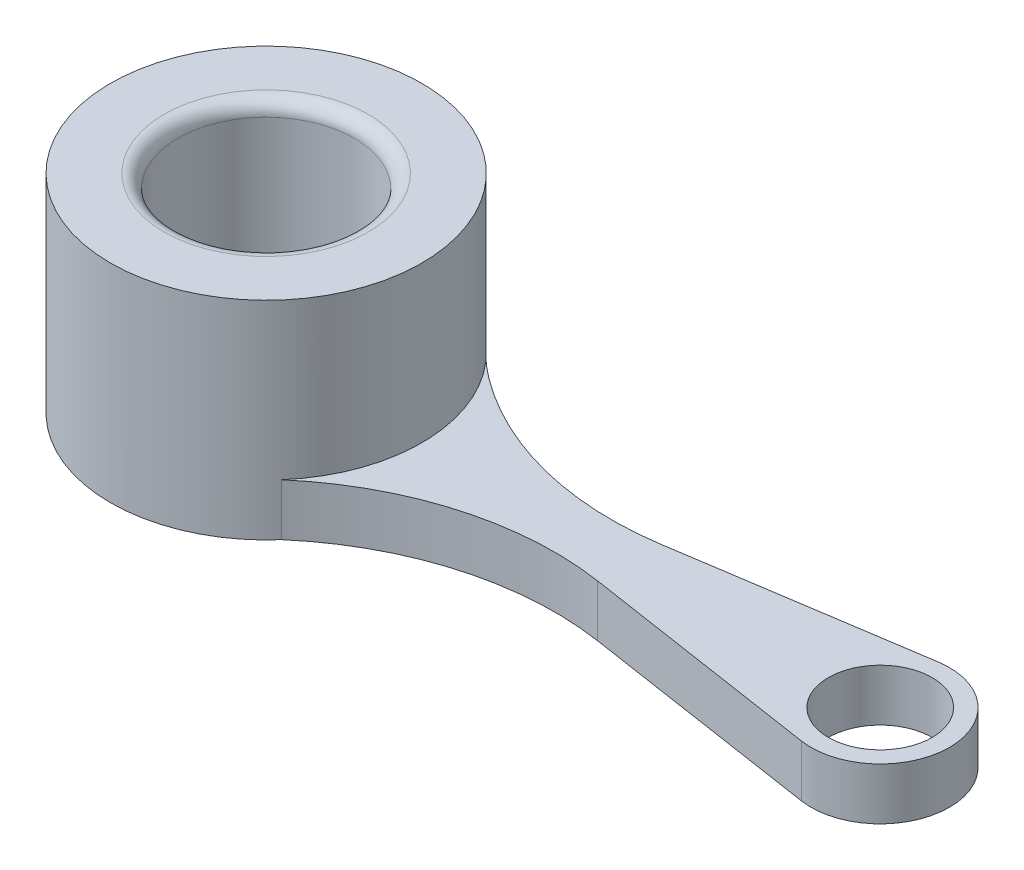
ISO-10303-21;
HEADER;
FILE_DESCRIPTION(('STEP AP214'),'2;1');
FILE_NAME('part.step','',(''),(''),'','','');
FILE_SCHEMA(('AUTOMOTIVE_DESIGN { 1 0 10303 214 1 1 1 1 }'));
ENDSEC;
DATA;
#1=APPLICATION_CONTEXT('core data for automotive mechanical design processes');
#2=APPLICATION_PROTOCOL_DEFINITION('international standard','automotive_design',2000,#1);
#3=PRODUCT_CONTEXT('',#1,'mechanical');
#4=PRODUCT('Part','Part','',(#3));
#5=PRODUCT_RELATED_PRODUCT_CATEGORY('part','',(#4));
#6=PRODUCT_DEFINITION_FORMATION('','',#4);
#7=PRODUCT_DEFINITION_CONTEXT('part definition',#1,'design');
#8=PRODUCT_DEFINITION('design','',#6,#7);
#9=PRODUCT_DEFINITION_SHAPE('','',#8);
#10=(LENGTH_UNIT() NAMED_UNIT(*) SI_UNIT(.MILLI.,.METRE.));
#11=(NAMED_UNIT(*) PLANE_ANGLE_UNIT() SI_UNIT($,.RADIAN.));
#12=(NAMED_UNIT(*) SI_UNIT($,.STERADIAN.) SOLID_ANGLE_UNIT());
#13=UNCERTAINTY_MEASURE_WITH_UNIT(LENGTH_MEASURE(1.E-05),#10,'distance_accuracy_value','');
#14=(GEOMETRIC_REPRESENTATION_CONTEXT(3) GLOBAL_UNCERTAINTY_ASSIGNED_CONTEXT((#13)) GLOBAL_UNIT_ASSIGNED_CONTEXT((#10,
#11,#12)) REPRESENTATION_CONTEXT('',''));
#15=CARTESIAN_POINT('',(0.,0.,0.));
#16=DIRECTION('',(0.,0.,1.));
#17=DIRECTION('',(1.,0.,0.));
#18=AXIS2_PLACEMENT_3D('',#15,#16,#17);
#19=CARTESIAN_POINT('',(0.,1.5,0.));
#20=DIRECTION('',(0.,1.,0.));
#21=DIRECTION('',(0.,0.,1.));
#22=AXIS2_PLACEMENT_3D('',#19,#20,#21);
#23=PLANE('',#22);
#24=CARTESIAN_POINT('',(22.25,1.5,-4.5));
#25=DIRECTION('',(0.,1.,0.));
#26=DIRECTION('',(0.,0.,1.));
#27=AXIS2_PLACEMENT_3D('',#24,#25,#26);
#28=CIRCLE('',#27,1.5);
#29=CARTESIAN_POINT('',(22.25,1.5,-3.));
#30=VERTEX_POINT('',#29);
#31=EDGE_CURVE('E168',#30,#30,#28,.F.);
#32=ORIENTED_EDGE('',*,*,#31,.T.);
#33=EDGE_LOOP('',(#32));
#34=FACE_BOUND('',#33,.T.);
#35=DIRECTION('',(0.988542407353188,0.,-0.150943396226415));
#36=VECTOR('',#35,1.);
#37=CARTESIAN_POINT('',(-0.466407587479488,1.5,-3.05454687559282));
#38=LINE('',#37,#36);
#39=CARTESIAN_POINT('',(15.,1.5,-5.41615733490219));
#40=VERTEX_POINT('',#39);
#41=CARTESIAN_POINT('',(21.9481132075472,1.5,-6.47708481470638));
#42=VERTEX_POINT('',#41);
#43=EDGE_CURVE('E112',#40,#42,#38,.T.);
#44=ORIENTED_EDGE('',*,*,#43,.F.);
#45=CARTESIAN_POINT('',(13.6637486076991,1.5,-14.167392574056));
#46=DIRECTION('',(0.,1.,0.));
#47=DIRECTION('',(0.,0.,1.));
#48=AXIS2_PLACEMENT_3D('',#45,#46,#47);
#49=CIRCLE('',#48,8.85266547399335);
#50=CARTESIAN_POINT('',(7.899255542353,1.5,-7.44873901147294));
#51=VERTEX_POINT('',#50);
#52=EDGE_CURVE('E56',#40,#51,#49,.F.);
#53=ORIENTED_EDGE('',*,*,#52,.T.);
#54=CARTESIAN_POINT('',(4.5,1.5,-4.5));
#55=DIRECTION('',(0.,1.,0.));
#56=DIRECTION('',(0.,0.,1.));
#57=AXIS2_PLACEMENT_3D('',#54,#55,#56);
#58=CIRCLE('',#57,4.5);
#59=CARTESIAN_POINT('',(7.89925554235302,1.5,-1.55126098852708));
#60=VERTEX_POINT('',#59);
#61=EDGE_CURVE('E164',#60,#51,#58,.T.);
#62=ORIENTED_EDGE('',*,*,#61,.F.);
#63=CARTESIAN_POINT('',(13.6637486076991,1.5,5.16739257405602));
#64=DIRECTION('',(0.,1.,0.));
#65=DIRECTION('',(0.,0.,1.));
#66=AXIS2_PLACEMENT_3D('',#63,#64,#65);
#67=CIRCLE('',#66,8.85266547399335);
#68=CARTESIAN_POINT('',(15.,1.5,-3.58384266509782));
#69=VERTEX_POINT('',#68);
#70=EDGE_CURVE('E123',#69,#60,#67,.T.);
#71=ORIENTED_EDGE('',*,*,#70,.F.);
#72=DIRECTION('',(0.988542407353188,0.,0.150943396226415));
#73=VECTOR('',#72,1.);
#74=CARTESIAN_POINT('',(0.87651794703805,1.5,-5.7403979446279));
#75=LINE('',#74,#73);
#76=CARTESIAN_POINT('',(21.9481132075472,1.5,-2.52291518529362));
#77=VERTEX_POINT('',#76);
#78=EDGE_CURVE('E119',#69,#77,#75,.T.);
#79=ORIENTED_EDGE('',*,*,#78,.T.);
#80=CARTESIAN_POINT('',(22.25,1.5,-4.5));
#81=DIRECTION('',(0.,1.,0.));
#82=DIRECTION('',(0.,0.,1.));
#83=AXIS2_PLACEMENT_3D('',#80,#81,#82);
#84=CIRCLE('',#83,2.);
#85=EDGE_CURVE('E101',#77,#42,#84,.T.);
#86=ORIENTED_EDGE('',*,*,#85,.T.);
#87=EDGE_LOOP('',(#44,#53,#62,#71,#79,#86));
#88=FACE_BOUND('',#87,.T.);
#89=ADVANCED_FACE('F39',(#34,#88),#23,.T.);
#90=CARTESIAN_POINT('',(0.,6.,0.));
#91=DIRECTION('',(0.,1.,0.));
#92=DIRECTION('',(0.,0.,1.));
#93=AXIS2_PLACEMENT_3D('',#90,#91,#92);
#94=PLANE('',#93);
#95=CARTESIAN_POINT('',(4.5,6.,-4.5));
#96=DIRECTION('',(0.,1.,0.));
#97=DIRECTION('',(0.,0.,1.));
#98=AXIS2_PLACEMENT_3D('',#95,#96,#97);
#99=CIRCLE('',#98,2.95);
#100=CARTESIAN_POINT('',(4.5,6.,-1.55));
#101=VERTEX_POINT('',#100);
#102=EDGE_CURVE('E11',#101,#101,#99,.F.);
#103=ORIENTED_EDGE('',*,*,#102,.T.);
#104=EDGE_LOOP('',(#103));
#105=FACE_BOUND('',#104,.T.);
#106=CARTESIAN_POINT('',(4.5,6.,-4.5));
#107=DIRECTION('',(0.,1.,0.));
#108=DIRECTION('',(0.,0.,1.));
#109=AXIS2_PLACEMENT_3D('',#106,#107,#108);
#110=CIRCLE('',#109,4.5);
#111=CARTESIAN_POINT('',(4.5,6.,0.));
#112=VERTEX_POINT('',#111);
#113=EDGE_CURVE('E163',#112,#112,#110,.T.);
#114=ORIENTED_EDGE('',*,*,#113,.T.);
#115=EDGE_LOOP('',(#114));
#116=FACE_BOUND('',#115,.T.);
#117=ADVANCED_FACE('F206',(#105,#116),#94,.T.);
#118=CARTESIAN_POINT('',(0.,0.,0.));
#119=DIRECTION('',(0.,1.,0.));
#120=DIRECTION('',(0.,0.,1.));
#121=AXIS2_PLACEMENT_3D('',#118,#119,#120);
#122=PLANE('',#121);
#123=CARTESIAN_POINT('',(4.5,0.,-4.5));
#124=DIRECTION('',(0.,1.,0.));
#125=DIRECTION('',(0.,0.,1.));
#126=AXIS2_PLACEMENT_3D('',#123,#124,#125);
#127=CIRCLE('',#126,4.5);
#128=CARTESIAN_POINT('',(7.899255542353,0.,-7.44873901147294));
#129=VERTEX_POINT('',#128);
#130=CARTESIAN_POINT('',(7.89925554235302,0.,-1.55126098852708));
#131=VERTEX_POINT('',#130);
#132=EDGE_CURVE('E64',#129,#131,#127,.T.);
#133=ORIENTED_EDGE('',*,*,#132,.F.);
#134=CARTESIAN_POINT('',(13.6637486076991,0.,-14.167392574056));
#135=DIRECTION('',(0.,1.,0.));
#136=DIRECTION('',(0.,0.,1.));
#137=AXIS2_PLACEMENT_3D('',#134,#135,#136);
#138=CIRCLE('',#137,8.85266547399335);
#139=CARTESIAN_POINT('',(15.,0.,-5.41615733490219));
#140=VERTEX_POINT('',#139);
#141=EDGE_CURVE('E154',#140,#129,#138,.F.);
#142=ORIENTED_EDGE('',*,*,#141,.F.);
#143=DIRECTION('',(0.988542407353188,0.,-0.150943396226415));
#144=VECTOR('',#143,1.);
#145=CARTESIAN_POINT('',(-0.466407587479489,0.,-3.05454687559283));
#146=LINE('',#145,#144);
#147=CARTESIAN_POINT('',(21.9481132075472,0.,-6.47708481470638));
#148=VERTEX_POINT('',#147);
#149=EDGE_CURVE('E133',#140,#148,#146,.T.);
#150=ORIENTED_EDGE('',*,*,#149,.T.);
#151=CARTESIAN_POINT('',(22.25,0.,-4.5));
#152=DIRECTION('',(0.,1.,0.));
#153=DIRECTION('',(0.,0.,1.));
#154=AXIS2_PLACEMENT_3D('',#151,#152,#153);
#155=CIRCLE('',#154,2.);
#156=CARTESIAN_POINT('',(21.9481132075472,0.,-2.52291518529362));
#157=VERTEX_POINT('',#156);
#158=EDGE_CURVE('E104',#157,#148,#155,.T.);
#159=ORIENTED_EDGE('',*,*,#158,.F.);
#160=DIRECTION('',(0.988542407353188,0.,0.150943396226415));
#161=VECTOR('',#160,1.);
#162=CARTESIAN_POINT('',(0.87651794703805,0.,-5.7403979446279));
#163=LINE('',#162,#161);
#164=CARTESIAN_POINT('',(15.,0.,-3.58384266509782));
#165=VERTEX_POINT('',#164);
#166=EDGE_CURVE('E148',#165,#157,#163,.T.);
#167=ORIENTED_EDGE('',*,*,#166,.F.);
#168=CARTESIAN_POINT('',(13.6637486076991,0.,5.16739257405602));
#169=DIRECTION('',(0.,1.,0.));
#170=DIRECTION('',(0.,0.,1.));
#171=AXIS2_PLACEMENT_3D('',#168,#169,#170);
#172=CIRCLE('',#171,8.85266547399335);
#173=EDGE_CURVE('E151',#165,#131,#172,.T.);
#174=ORIENTED_EDGE('',*,*,#173,.T.);
#175=EDGE_LOOP('',(#133,#142,#150,#159,#167,#174));
#176=FACE_BOUND('',#175,.T.);
#177=CARTESIAN_POINT('',(4.5,0.,-4.5));
#178=DIRECTION('',(0.,-1.,0.));
#179=DIRECTION('',(0.,0.,-1.));
#180=AXIS2_PLACEMENT_3D('',#177,#178,#179);
#181=CIRCLE('',#180,1.);
#182=CARTESIAN_POINT('',(4.5,0.,-5.5));
#183=VERTEX_POINT('',#182);
#184=EDGE_CURVE('E157',#183,#183,#181,.T.);
#185=ORIENTED_EDGE('',*,*,#184,.F.);
#186=EDGE_LOOP('',(#185));
#187=FACE_BOUND('',#186,.T.);
#188=CARTESIAN_POINT('',(22.25,0.,-4.5));
#189=DIRECTION('',(0.,1.,0.));
#190=DIRECTION('',(0.,0.,1.));
#191=AXIS2_PLACEMENT_3D('',#188,#189,#190);
#192=CIRCLE('',#191,1.5);
#193=CARTESIAN_POINT('',(22.25,0.,-3.));
#194=VERTEX_POINT('',#193);
#195=EDGE_CURVE('E172',#194,#194,#192,.T.);
#196=ORIENTED_EDGE('',*,*,#195,.T.);
#197=EDGE_LOOP('',(#196));
#198=FACE_BOUND('',#197,.T.);
#199=ADVANCED_FACE('F212',(#176,#187,#198),#122,.F.);
#200=CARTESIAN_POINT('',(22.25,0.,-4.5));
#201=DIRECTION('',(0.,1.,0.));
#202=DIRECTION('',(0.,0.,1.));
#203=AXIS2_PLACEMENT_3D('',#200,#201,#202);
#204=CYLINDRICAL_SURFACE('',#203,1.5);
#205=ORIENTED_EDGE('',*,*,#195,.F.);
#206=EDGE_LOOP('',(#205));
#207=FACE_BOUND('',#206,.T.);
#208=ORIENTED_EDGE('',*,*,#31,.F.);
#209=EDGE_LOOP('',(#208));
#210=FACE_BOUND('',#209,.T.);
#211=ADVANCED_FACE('F217',(#207,#210),#204,.F.);
#212=CARTESIAN_POINT('',(4.5,1.,-4.5));
#213=DIRECTION('',(0.,1.,0.));
#214=DIRECTION('',(0.,0.,1.));
#215=AXIS2_PLACEMENT_3D('',#212,#213,#214);
#216=CYLINDRICAL_SURFACE('',#215,2.55);
#217=CARTESIAN_POINT('',(4.5,5.6,-4.5));
#218=DIRECTION('',(0.,1.,0.));
#219=DIRECTION('',(0.,0.,1.));
#220=AXIS2_PLACEMENT_3D('',#217,#218,#219);
#221=CIRCLE('',#220,2.55);
#222=CARTESIAN_POINT('',(4.5,5.6,-1.95));
#223=VERTEX_POINT('',#222);
#224=EDGE_CURVE('E49',#223,#223,#221,.T.);
#225=ORIENTED_EDGE('',*,*,#224,.T.);
#226=EDGE_LOOP('',(#225));
#227=FACE_BOUND('',#226,.T.);
#228=CARTESIAN_POINT('',(4.5,1.,-4.5));
#229=DIRECTION('',(0.,1.,0.));
#230=DIRECTION('',(0.,0.,1.));
#231=AXIS2_PLACEMENT_3D('',#228,#229,#230);
#232=CIRCLE('',#231,2.55);
#233=CARTESIAN_POINT('',(4.5,1.,-1.95));
#234=VERTEX_POINT('',#233);
#235=EDGE_CURVE('E179',#234,#234,#232,.T.);
#236=ORIENTED_EDGE('',*,*,#235,.F.);
#237=EDGE_LOOP('',(#236));
#238=FACE_BOUND('',#237,.T.);
#239=ADVANCED_FACE('F187',(#227,#238),#216,.F.);
#240=CARTESIAN_POINT('',(4.5,1.,-4.5));
#241=DIRECTION('',(0.,1.,0.));
#242=DIRECTION('',(0.,0.,1.));
#243=AXIS2_PLACEMENT_3D('',#240,#241,#242);
#244=PLANE('',#243);
#245=CARTESIAN_POINT('',(4.5,1.,-4.5));
#246=DIRECTION('',(0.,1.,0.));
#247=DIRECTION('',(0.,0.,1.));
#248=AXIS2_PLACEMENT_3D('',#245,#246,#247);
#249=CIRCLE('',#248,1.);
#250=CARTESIAN_POINT('',(4.5,1.,-3.5));
#251=VERTEX_POINT('',#250);
#252=EDGE_CURVE('E43',#251,#251,#249,.T.);
#253=ORIENTED_EDGE('',*,*,#252,.F.);
#254=EDGE_LOOP('',(#253));
#255=FACE_BOUND('',#254,.T.);
#256=ORIENTED_EDGE('',*,*,#235,.T.);
#257=EDGE_LOOP('',(#256));
#258=FACE_BOUND('',#257,.T.);
#259=ADVANCED_FACE('F201',(#255,#258),#244,.T.);
#260=CARTESIAN_POINT('',(4.5,1.5,-4.5));
#261=DIRECTION('',(0.,1.,0.));
#262=DIRECTION('',(0.,0.,1.));
#263=AXIS2_PLACEMENT_3D('',#260,#261,#262);
#264=CYLINDRICAL_SURFACE('',#263,4.5);
#265=ORIENTED_EDGE('',*,*,#113,.F.);
#266=EDGE_LOOP('',(#265));
#267=FACE_BOUND('',#266,.T.);
#268=ORIENTED_EDGE('',*,*,#132,.T.);
#269=DIRECTION('',(0.,1.,0.));
#270=VECTOR('',#269,1.);
#271=CARTESIAN_POINT('',(7.89925554235302,-8.5,-1.55126098852708));
#272=LINE('',#271,#270);
#273=EDGE_CURVE('E134',#131,#60,#272,.T.);
#274=ORIENTED_EDGE('',*,*,#273,.T.);
#275=ORIENTED_EDGE('',*,*,#61,.T.);
#276=DIRECTION('',(0.,1.,0.));
#277=VECTOR('',#276,1.);
#278=CARTESIAN_POINT('',(7.899255542353,-8.5,-7.44873901147294));
#279=LINE('',#278,#277);
#280=EDGE_CURVE('E130',#129,#51,#279,.T.);
#281=ORIENTED_EDGE('',*,*,#280,.F.);
#282=EDGE_LOOP('',(#268,#274,#275,#281));
#283=FACE_BOUND('',#282,.T.);
#284=ADVANCED_FACE('F192',(#267,#283),#264,.T.);
#285=CARTESIAN_POINT('',(4.5,5.6,-4.5));
#286=DIRECTION('',(0.,1.,0.));
#287=DIRECTION('',(0.,0.,1.));
#288=AXIS2_PLACEMENT_3D('',#285,#286,#287);
#289=TOROIDAL_SURFACE('',#288,2.95,0.4);
#290=ORIENTED_EDGE('',*,*,#102,.F.);
#291=EDGE_LOOP('',(#290));
#292=FACE_BOUND('',#291,.T.);
#293=ORIENTED_EDGE('',*,*,#224,.F.);
#294=EDGE_LOOP('',(#293));
#295=FACE_BOUND('',#294,.T.);
#296=ADVANCED_FACE('F41',(#292,#295),#289,.T.);
#297=CARTESIAN_POINT('',(4.5,6.,-4.5));
#298=DIRECTION('',(0.,-1.,0.));
#299=DIRECTION('',(0.,0.,-1.));
#300=AXIS2_PLACEMENT_3D('',#297,#298,#299);
#301=CYLINDRICAL_SURFACE('',#300,1.);
#302=ORIENTED_EDGE('',*,*,#252,.T.);
#303=EDGE_LOOP('',(#302));
#304=FACE_BOUND('',#303,.T.);
#305=ORIENTED_EDGE('',*,*,#184,.T.);
#306=EDGE_LOOP('',(#305));
#307=FACE_BOUND('',#306,.T.);
#308=ADVANCED_FACE('F191',(#304,#307),#301,.F.);
#309=CARTESIAN_POINT('',(13.6637486076991,-8.5,-14.167392574056));
#310=DIRECTION('',(0.,1.,0.));
#311=DIRECTION('',(0.,0.,1.));
#312=AXIS2_PLACEMENT_3D('',#309,#310,#311);
#313=CYLINDRICAL_SURFACE('',#312,8.85266547399335);
#314=ORIENTED_EDGE('',*,*,#141,.T.);
#315=ORIENTED_EDGE('',*,*,#280,.T.);
#316=ORIENTED_EDGE('',*,*,#52,.F.);
#317=DIRECTION('',(0.,1.,0.));
#318=VECTOR('',#317,1.);
#319=CARTESIAN_POINT('',(15.,-8.5,-5.41615733490219));
#320=LINE('',#319,#318);
#321=EDGE_CURVE('E109',#140,#40,#320,.T.);
#322=ORIENTED_EDGE('',*,*,#321,.F.);
#323=EDGE_LOOP('',(#314,#315,#316,#322));
#324=FACE_BOUND('',#323,.T.);
#325=ADVANCED_FACE('F198',(#324),#313,.F.);
#326=CARTESIAN_POINT('',(13.6637486076991,-8.5,5.16739257405602));
#327=DIRECTION('',(0.,1.,0.));
#328=DIRECTION('',(0.,0.,1.));
#329=AXIS2_PLACEMENT_3D('',#326,#327,#328);
#330=CYLINDRICAL_SURFACE('',#329,8.85266547399335);
#331=DIRECTION('',(0.,1.,0.));
#332=VECTOR('',#331,1.);
#333=CARTESIAN_POINT('',(15.,-8.5,-3.58384266509782));
#334=LINE('',#333,#332);
#335=EDGE_CURVE('E137',#165,#69,#334,.T.);
#336=ORIENTED_EDGE('',*,*,#335,.T.);
#337=ORIENTED_EDGE('',*,*,#70,.T.);
#338=ORIENTED_EDGE('',*,*,#273,.F.);
#339=ORIENTED_EDGE('',*,*,#173,.F.);
#340=EDGE_LOOP('',(#336,#337,#338,#339));
#341=FACE_BOUND('',#340,.T.);
#342=ADVANCED_FACE('F264',(#341),#330,.F.);
#343=CARTESIAN_POINT('',(0.87651794703805,-8.5,-5.7403979446279));
#344=DIRECTION('',(-0.150943396226415,0.,0.988542407353188));
#345=DIRECTION('',(0.988542407353188,0.,0.150943396226415));
#346=AXIS2_PLACEMENT_3D('',#343,#344,#345);
#347=PLANE('',#346);
#348=ORIENTED_EDGE('',*,*,#166,.T.);
#349=DIRECTION('',(0.,1.,0.));
#350=VECTOR('',#349,1.);
#351=CARTESIAN_POINT('',(21.9481132075472,-8.5,-2.52291518529362));
#352=LINE('',#351,#350);
#353=EDGE_CURVE('E108',#157,#77,#352,.T.);
#354=ORIENTED_EDGE('',*,*,#353,.T.);
#355=ORIENTED_EDGE('',*,*,#78,.F.);
#356=ORIENTED_EDGE('',*,*,#335,.F.);
#357=EDGE_LOOP('',(#348,#354,#355,#356));
#358=FACE_BOUND('',#357,.T.);
#359=ADVANCED_FACE('F272',(#358),#347,.T.);
#360=CARTESIAN_POINT('',(22.25,-8.5,-4.5));
#361=DIRECTION('',(0.,1.,0.));
#362=DIRECTION('',(0.,0.,1.));
#363=AXIS2_PLACEMENT_3D('',#360,#361,#362);
#364=CYLINDRICAL_SURFACE('',#363,2.);
#365=ORIENTED_EDGE('',*,*,#158,.T.);
#366=DIRECTION('',(0.,1.,0.));
#367=VECTOR('',#366,1.);
#368=CARTESIAN_POINT('',(21.9481132075472,-8.5,-6.47708481470638));
#369=LINE('',#368,#367);
#370=EDGE_CURVE('E96',#148,#42,#369,.T.);
#371=ORIENTED_EDGE('',*,*,#370,.T.);
#372=ORIENTED_EDGE('',*,*,#85,.F.);
#373=ORIENTED_EDGE('',*,*,#353,.F.);
#374=EDGE_LOOP('',(#365,#371,#372,#373));
#375=FACE_BOUND('',#374,.T.);
#376=ADVANCED_FACE('F98',(#375),#364,.T.);
#377=CARTESIAN_POINT('',(-0.466407587479488,-8.5,-3.05454687559282));
#378=DIRECTION('',(0.150943396226415,0.,0.988542407353188));
#379=DIRECTION('',(0.988542407353188,0.,-0.150943396226415));
#380=AXIS2_PLACEMENT_3D('',#377,#378,#379);
#381=PLANE('',#380);
#382=ORIENTED_EDGE('',*,*,#321,.T.);
#383=ORIENTED_EDGE('',*,*,#43,.T.);
#384=ORIENTED_EDGE('',*,*,#370,.F.);
#385=ORIENTED_EDGE('',*,*,#149,.F.);
#386=EDGE_LOOP('',(#382,#383,#384,#385));
#387=FACE_BOUND('',#386,.T.);
#388=ADVANCED_FACE('F113',(#387),#381,.F.);
#389=CLOSED_SHELL('',(#89,#117,#199,#211,#239,#259,#284,#296,#308,#325,#342,#359,#376,#388));
#390=MANIFOLD_SOLID_BREP('B2',#389);
#391=ADVANCED_BREP_SHAPE_REPRESENTATION('',(#18,#390),#14);
#392=SHAPE_DEFINITION_REPRESENTATION(#9,#391);
ENDSEC;
END-ISO-10303-21;
